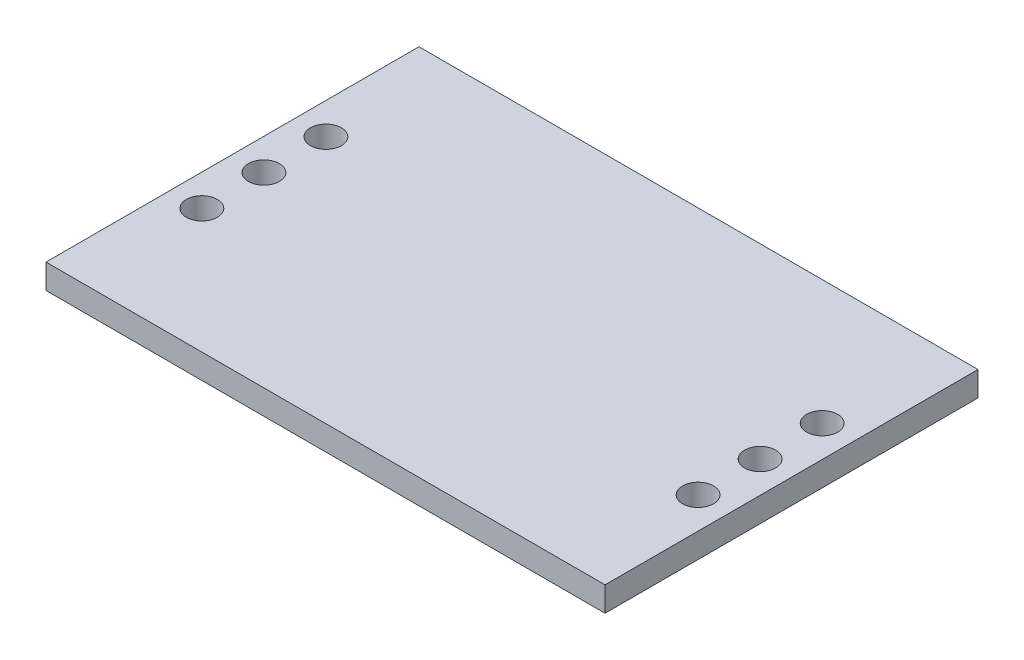
ISO-10303-21;
HEADER;
FILE_DESCRIPTION(('STEP AP214'),'2;1');
FILE_NAME('part.step','',(''),(''),'','','');
FILE_SCHEMA(('AUTOMOTIVE_DESIGN { 1 0 10303 214 1 1 1 1 }'));
ENDSEC;
DATA;
#1=APPLICATION_CONTEXT('core data for automotive mechanical design processes');
#2=APPLICATION_PROTOCOL_DEFINITION('international standard','automotive_design',2000,#1);
#3=PRODUCT_CONTEXT('',#1,'mechanical');
#4=PRODUCT('Part','Part','',(#3));
#5=PRODUCT_RELATED_PRODUCT_CATEGORY('part','',(#4));
#6=PRODUCT_DEFINITION_FORMATION('','',#4);
#7=PRODUCT_DEFINITION_CONTEXT('part definition',#1,'design');
#8=PRODUCT_DEFINITION('design','',#6,#7);
#9=PRODUCT_DEFINITION_SHAPE('','',#8);
#10=(LENGTH_UNIT() NAMED_UNIT(*) SI_UNIT(.MILLI.,.METRE.));
#11=(NAMED_UNIT(*) PLANE_ANGLE_UNIT() SI_UNIT($,.RADIAN.));
#12=(NAMED_UNIT(*) SI_UNIT($,.STERADIAN.) SOLID_ANGLE_UNIT());
#13=UNCERTAINTY_MEASURE_WITH_UNIT(LENGTH_MEASURE(1.E-05),#10,'distance_accuracy_value','');
#14=(GEOMETRIC_REPRESENTATION_CONTEXT(3) GLOBAL_UNCERTAINTY_ASSIGNED_CONTEXT((#13)) GLOBAL_UNIT_ASSIGNED_CONTEXT((#10,
#11,#12)) REPRESENTATION_CONTEXT('',''));
#15=CARTESIAN_POINT('',(0.,0.,0.));
#16=DIRECTION('',(0.,0.,1.));
#17=DIRECTION('',(1.,0.,0.));
#18=AXIS2_PLACEMENT_3D('',#15,#16,#17);
#19=CARTESIAN_POINT('',(0.,3.175,0.));
#20=DIRECTION('',(0.,-1.,0.));
#21=DIRECTION('',(0.,0.,-1.));
#22=AXIS2_PLACEMENT_3D('',#19,#20,#21);
#23=PLANE('',#22);
#24=CARTESIAN_POINT('',(18.5647089224189,3.175,-3.90059165973626));
#25=DIRECTION('',(0.,1.,0.));
#26=DIRECTION('',(0.,0.,1.));
#27=AXIS2_PLACEMENT_3D('',#24,#25,#26);
#28=CIRCLE('',#27,2.);
#29=CARTESIAN_POINT('',(18.5647089224189,3.175,-1.90059165973626));
#30=VERTEX_POINT('',#29);
#31=EDGE_CURVE('E149',#30,#30,#28,.T.);
#32=ORIENTED_EDGE('',*,*,#31,.F.);
#33=EDGE_LOOP('',(#32));
#34=FACE_BOUND('',#33,.T.);
#35=DIRECTION('',(0.,0.,1.));
#36=VECTOR('',#35,1.);
#37=CARTESIAN_POINT('',(-49.4852910775811,3.175,28.1494083402637));
#38=LINE('',#37,#36);
#39=CARTESIAN_POINT('',(-49.4852910775811,3.175,-19.9505916597363));
#40=VERTEX_POINT('',#39);
#41=CARTESIAN_POINT('',(-49.4852910775811,3.175,28.1494083402637));
#42=VERTEX_POINT('',#41);
#43=EDGE_CURVE('E98',#40,#42,#38,.T.);
#44=ORIENTED_EDGE('',*,*,#43,.T.);
#45=DIRECTION('',(1.,0.,0.));
#46=VECTOR('',#45,1.);
#47=CARTESIAN_POINT('',(22.6147089224189,3.175,28.1494083402637));
#48=LINE('',#47,#46);
#49=CARTESIAN_POINT('',(22.6147089224189,3.175,28.1494083402637));
#50=VERTEX_POINT('',#49);
#51=EDGE_CURVE('E93',#42,#50,#48,.T.);
#52=ORIENTED_EDGE('',*,*,#51,.T.);
#53=DIRECTION('',(0.,0.,-1.));
#54=VECTOR('',#53,1.);
#55=CARTESIAN_POINT('',(22.6147089224189,3.175,-19.9505916597363));
#56=LINE('',#55,#54);
#57=CARTESIAN_POINT('',(22.6147089224189,3.175,-19.9505916597363));
#58=VERTEX_POINT('',#57);
#59=EDGE_CURVE('E96',#50,#58,#56,.T.);
#60=ORIENTED_EDGE('',*,*,#59,.T.);
#61=DIRECTION('',(-1.,0.,0.));
#62=VECTOR('',#61,1.);
#63=CARTESIAN_POINT('',(-49.4852910775811,3.175,-19.9505916597363));
#64=LINE('',#63,#62);
#65=EDGE_CURVE('E63',#58,#40,#64,.T.);
#66=ORIENTED_EDGE('',*,*,#65,.T.);
#67=EDGE_LOOP('',(#44,#52,#60,#66));
#68=FACE_BOUND('',#67,.T.);
#69=CARTESIAN_POINT('',(-45.4352910775811,3.175,4.09940834026373));
#70=DIRECTION('',(0.,-1.,0.));
#71=DIRECTION('',(0.,0.,-1.));
#72=AXIS2_PLACEMENT_3D('',#69,#70,#71);
#73=CIRCLE('',#72,2.);
#74=CARTESIAN_POINT('',(-45.4352910775811,3.175,2.09940834026372));
#75=VERTEX_POINT('',#74);
#76=EDGE_CURVE('E136',#75,#75,#73,.T.);
#77=ORIENTED_EDGE('',*,*,#76,.T.);
#78=EDGE_LOOP('',(#77));
#79=FACE_BOUND('',#78,.T.);
#80=CARTESIAN_POINT('',(-45.4352910775811,3.175,-3.90059165973627));
#81=DIRECTION('',(0.,-1.,0.));
#82=DIRECTION('',(0.,0.,-1.));
#83=AXIS2_PLACEMENT_3D('',#80,#81,#82);
#84=CIRCLE('',#83,2.);
#85=CARTESIAN_POINT('',(-45.4352910775811,3.175,-5.90059165973627));
#86=VERTEX_POINT('',#85);
#87=EDGE_CURVE('E165',#86,#86,#84,.T.);
#88=ORIENTED_EDGE('',*,*,#87,.T.);
#89=EDGE_LOOP('',(#88));
#90=FACE_BOUND('',#89,.T.);
#91=CARTESIAN_POINT('',(18.5647089224189,3.175,12.0994083402637));
#92=DIRECTION('',(0.,-1.,0.));
#93=DIRECTION('',(0.,0.,-1.));
#94=AXIS2_PLACEMENT_3D('',#91,#92,#93);
#95=CIRCLE('',#94,2.);
#96=CARTESIAN_POINT('',(18.5647089224189,3.175,10.0994083402637));
#97=VERTEX_POINT('',#96);
#98=EDGE_CURVE('E140',#97,#97,#95,.T.);
#99=ORIENTED_EDGE('',*,*,#98,.T.);
#100=EDGE_LOOP('',(#99));
#101=FACE_BOUND('',#100,.T.);
#102=CARTESIAN_POINT('',(18.5647089224189,3.175,4.09940834026374));
#103=DIRECTION('',(0.,1.,0.));
#104=DIRECTION('',(0.,0.,1.));
#105=AXIS2_PLACEMENT_3D('',#102,#103,#104);
#106=CIRCLE('',#105,2.);
#107=CARTESIAN_POINT('',(18.5647089224189,3.175,6.09940834026374));
#108=VERTEX_POINT('',#107);
#109=EDGE_CURVE('E148',#108,#108,#106,.T.);
#110=ORIENTED_EDGE('',*,*,#109,.F.);
#111=EDGE_LOOP('',(#110));
#112=FACE_BOUND('',#111,.T.);
#113=CARTESIAN_POINT('',(-45.4352910775811,3.175,12.0994083402637));
#114=DIRECTION('',(0.,1.,0.));
#115=DIRECTION('',(0.,0.,1.));
#116=AXIS2_PLACEMENT_3D('',#113,#114,#115);
#117=CIRCLE('',#116,2.);
#118=CARTESIAN_POINT('',(-45.4352910775811,3.175,14.0994083402637));
#119=VERTEX_POINT('',#118);
#120=EDGE_CURVE('E164',#119,#119,#117,.T.);
#121=ORIENTED_EDGE('',*,*,#120,.F.);
#122=EDGE_LOOP('',(#121));
#123=FACE_BOUND('',#122,.T.);
#124=ADVANCED_FACE('F45',(#34,#68,#79,#90,#101,#112,#123),#23,.F.);
#125=CARTESIAN_POINT('',(0.,0.,0.));
#126=DIRECTION('',(0.,-1.,0.));
#127=DIRECTION('',(0.,0.,-1.));
#128=AXIS2_PLACEMENT_3D('',#125,#126,#127);
#129=PLANE('',#128);
#130=CARTESIAN_POINT('',(18.5647089224189,0.,12.0994083402637));
#131=DIRECTION('',(0.,-1.,0.));
#132=DIRECTION('',(0.,0.,-1.));
#133=AXIS2_PLACEMENT_3D('',#130,#131,#132);
#134=CIRCLE('',#133,2.);
#135=CARTESIAN_POINT('',(18.5647089224189,0.,10.0994083402637));
#136=VERTEX_POINT('',#135);
#137=EDGE_CURVE('E153',#136,#136,#134,.T.);
#138=ORIENTED_EDGE('',*,*,#137,.F.);
#139=EDGE_LOOP('',(#138));
#140=FACE_BOUND('',#139,.T.);
#141=CARTESIAN_POINT('',(-45.4352910775811,0.,-3.90059165973627));
#142=DIRECTION('',(0.,-1.,0.));
#143=DIRECTION('',(0.,0.,-1.));
#144=AXIS2_PLACEMENT_3D('',#141,#142,#143);
#145=CIRCLE('',#144,2.);
#146=CARTESIAN_POINT('',(-45.4352910775811,0.,-5.90059165973627));
#147=VERTEX_POINT('',#146);
#148=EDGE_CURVE('E176',#147,#147,#145,.T.);
#149=ORIENTED_EDGE('',*,*,#148,.F.);
#150=EDGE_LOOP('',(#149));
#151=FACE_BOUND('',#150,.T.);
#152=CARTESIAN_POINT('',(-45.4352910775811,0.,4.09940834026373));
#153=DIRECTION('',(0.,-1.,0.));
#154=DIRECTION('',(0.,0.,-1.));
#155=AXIS2_PLACEMENT_3D('',#152,#153,#154);
#156=CIRCLE('',#155,2.);
#157=CARTESIAN_POINT('',(-45.4352910775811,0.,2.09940834026372));
#158=VERTEX_POINT('',#157);
#159=EDGE_CURVE('E118',#158,#158,#156,.T.);
#160=ORIENTED_EDGE('',*,*,#159,.F.);
#161=EDGE_LOOP('',(#160));
#162=FACE_BOUND('',#161,.T.);
#163=DIRECTION('',(0.,0.,1.));
#164=VECTOR('',#163,1.);
#165=CARTESIAN_POINT('',(-49.4852910775811,0.,28.1494083402637));
#166=LINE('',#165,#164);
#167=CARTESIAN_POINT('',(-49.4852910775811,0.,-19.9505916597363));
#168=VERTEX_POINT('',#167);
#169=CARTESIAN_POINT('',(-49.4852910775811,0.,28.1494083402637));
#170=VERTEX_POINT('',#169);
#171=EDGE_CURVE('E114',#168,#170,#166,.T.);
#172=ORIENTED_EDGE('',*,*,#171,.F.);
#173=DIRECTION('',(-1.,0.,0.));
#174=VECTOR('',#173,1.);
#175=CARTESIAN_POINT('',(-49.4852910775811,0.,-19.9505916597363));
#176=LINE('',#175,#174);
#177=CARTESIAN_POINT('',(22.6147089224189,0.,-19.9505916597363));
#178=VERTEX_POINT('',#177);
#179=EDGE_CURVE('E86',#178,#168,#176,.T.);
#180=ORIENTED_EDGE('',*,*,#179,.F.);
#181=DIRECTION('',(0.,0.,-1.));
#182=VECTOR('',#181,1.);
#183=CARTESIAN_POINT('',(22.6147089224189,0.,-19.9505916597363));
#184=LINE('',#183,#182);
#185=CARTESIAN_POINT('',(22.6147089224189,0.,28.1494083402637));
#186=VERTEX_POINT('',#185);
#187=EDGE_CURVE('E80',#186,#178,#184,.T.);
#188=ORIENTED_EDGE('',*,*,#187,.F.);
#189=DIRECTION('',(1.,0.,0.));
#190=VECTOR('',#189,1.);
#191=CARTESIAN_POINT('',(22.6147089224189,0.,28.1494083402637));
#192=LINE('',#191,#190);
#193=EDGE_CURVE('E103',#170,#186,#192,.T.);
#194=ORIENTED_EDGE('',*,*,#193,.F.);
#195=EDGE_LOOP('',(#172,#180,#188,#194));
#196=FACE_BOUND('',#195,.T.);
#197=CARTESIAN_POINT('',(18.5647089224189,0.,4.09940834026374));
#198=DIRECTION('',(0.,1.,0.));
#199=DIRECTION('',(0.,0.,1.));
#200=AXIS2_PLACEMENT_3D('',#197,#198,#199);
#201=CIRCLE('',#200,2.);
#202=CARTESIAN_POINT('',(18.5647089224189,0.,6.09940834026374));
#203=VERTEX_POINT('',#202);
#204=EDGE_CURVE('E144',#203,#203,#201,.T.);
#205=ORIENTED_EDGE('',*,*,#204,.T.);
#206=EDGE_LOOP('',(#205));
#207=FACE_BOUND('',#206,.T.);
#208=CARTESIAN_POINT('',(18.5647089224189,0.,-3.90059165973626));
#209=DIRECTION('',(0.,1.,0.));
#210=DIRECTION('',(0.,0.,1.));
#211=AXIS2_PLACEMENT_3D('',#208,#209,#210);
#212=CIRCLE('',#211,2.);
#213=CARTESIAN_POINT('',(18.5647089224189,0.,-1.90059165973626));
#214=VERTEX_POINT('',#213);
#215=EDGE_CURVE('E169',#214,#214,#212,.T.);
#216=ORIENTED_EDGE('',*,*,#215,.T.);
#217=EDGE_LOOP('',(#216));
#218=FACE_BOUND('',#217,.T.);
#219=CARTESIAN_POINT('',(-45.4352910775811,0.,12.0994083402637));
#220=DIRECTION('',(0.,1.,0.));
#221=DIRECTION('',(0.,0.,1.));
#222=AXIS2_PLACEMENT_3D('',#219,#220,#221);
#223=CIRCLE('',#222,2.);
#224=CARTESIAN_POINT('',(-45.4352910775811,0.,14.0994083402637));
#225=VERTEX_POINT('',#224);
#226=EDGE_CURVE('E160',#225,#225,#223,.T.);
#227=ORIENTED_EDGE('',*,*,#226,.T.);
#228=EDGE_LOOP('',(#227));
#229=FACE_BOUND('',#228,.T.);
#230=ADVANCED_FACE('F131',(#140,#151,#162,#196,#207,#218,#229),#129,.T.);
#231=CARTESIAN_POINT('',(-49.4852910775811,3.175,28.1494083402637));
#232=DIRECTION('',(1.,0.,0.));
#233=DIRECTION('',(0.,0.,-1.));
#234=AXIS2_PLACEMENT_3D('',#231,#232,#233);
#235=PLANE('',#234);
#236=ORIENTED_EDGE('',*,*,#171,.T.);
#237=DIRECTION('',(0.,-1.,0.));
#238=VECTOR('',#237,1.);
#239=CARTESIAN_POINT('',(-49.4852910775811,3.175,28.1494083402637));
#240=LINE('',#239,#238);
#241=EDGE_CURVE('E11',#42,#170,#240,.T.);
#242=ORIENTED_EDGE('',*,*,#241,.F.);
#243=ORIENTED_EDGE('',*,*,#43,.F.);
#244=DIRECTION('',(0.,-1.,0.));
#245=VECTOR('',#244,1.);
#246=CARTESIAN_POINT('',(-49.4852910775811,3.175,-19.9505916597363));
#247=LINE('',#246,#245);
#248=EDGE_CURVE('E110',#40,#168,#247,.T.);
#249=ORIENTED_EDGE('',*,*,#248,.T.);
#250=EDGE_LOOP('',(#236,#242,#243,#249));
#251=FACE_BOUND('',#250,.T.);
#252=ADVANCED_FACE('F47',(#251),#235,.F.);
#253=CARTESIAN_POINT('',(22.6147089224189,3.175,28.1494083402637));
#254=DIRECTION('',(0.,0.,-1.));
#255=DIRECTION('',(-1.,0.,0.));
#256=AXIS2_PLACEMENT_3D('',#253,#254,#255);
#257=PLANE('',#256);
#258=ORIENTED_EDGE('',*,*,#193,.T.);
#259=DIRECTION('',(0.,-1.,0.));
#260=VECTOR('',#259,1.);
#261=CARTESIAN_POINT('',(22.6147089224189,3.175,28.1494083402637));
#262=LINE('',#261,#260);
#263=EDGE_CURVE('E55',#50,#186,#262,.T.);
#264=ORIENTED_EDGE('',*,*,#263,.F.);
#265=ORIENTED_EDGE('',*,*,#51,.F.);
#266=ORIENTED_EDGE('',*,*,#241,.T.);
#267=EDGE_LOOP('',(#258,#264,#265,#266));
#268=FACE_BOUND('',#267,.T.);
#269=ADVANCED_FACE('F102',(#268),#257,.F.);
#270=CARTESIAN_POINT('',(22.6147089224189,3.175,-19.9505916597363));
#271=DIRECTION('',(-1.,0.,0.));
#272=DIRECTION('',(0.,0.,1.));
#273=AXIS2_PLACEMENT_3D('',#270,#271,#272);
#274=PLANE('',#273);
#275=ORIENTED_EDGE('',*,*,#187,.T.);
#276=DIRECTION('',(0.,-1.,0.));
#277=VECTOR('',#276,1.);
#278=CARTESIAN_POINT('',(22.6147089224189,3.175,-19.9505916597363));
#279=LINE('',#278,#277);
#280=EDGE_CURVE('E105',#58,#178,#279,.T.);
#281=ORIENTED_EDGE('',*,*,#280,.F.);
#282=ORIENTED_EDGE('',*,*,#59,.F.);
#283=ORIENTED_EDGE('',*,*,#263,.T.);
#284=EDGE_LOOP('',(#275,#281,#282,#283));
#285=FACE_BOUND('',#284,.T.);
#286=ADVANCED_FACE('F106',(#285),#274,.F.);
#287=CARTESIAN_POINT('',(-49.4852910775811,3.175,-19.9505916597363));
#288=DIRECTION('',(0.,0.,1.));
#289=DIRECTION('',(1.,0.,0.));
#290=AXIS2_PLACEMENT_3D('',#287,#288,#289);
#291=PLANE('',#290);
#292=ORIENTED_EDGE('',*,*,#179,.T.);
#293=ORIENTED_EDGE('',*,*,#248,.F.);
#294=ORIENTED_EDGE('',*,*,#65,.F.);
#295=ORIENTED_EDGE('',*,*,#280,.T.);
#296=EDGE_LOOP('',(#292,#293,#294,#295));
#297=FACE_BOUND('',#296,.T.);
#298=ADVANCED_FACE('F128',(#297),#291,.F.);
#299=CARTESIAN_POINT('',(-45.4352910775811,0.,4.09940834026373));
#300=DIRECTION('',(0.,1.,0.));
#301=DIRECTION('',(0.,0.,1.));
#302=AXIS2_PLACEMENT_3D('',#299,#300,#301);
#303=CYLINDRICAL_SURFACE('',#302,2.);
#304=ORIENTED_EDGE('',*,*,#159,.T.);
#305=EDGE_LOOP('',(#304));
#306=FACE_BOUND('',#305,.T.);
#307=ORIENTED_EDGE('',*,*,#76,.F.);
#308=EDGE_LOOP('',(#307));
#309=FACE_BOUND('',#308,.T.);
#310=ADVANCED_FACE('F189',(#306,#309),#303,.F.);
#311=CARTESIAN_POINT('',(-45.4352910775811,0.,-3.90059165973627));
#312=DIRECTION('',(0.,1.,0.));
#313=DIRECTION('',(0.,0.,1.));
#314=AXIS2_PLACEMENT_3D('',#311,#312,#313);
#315=CYLINDRICAL_SURFACE('',#314,2.);
#316=ORIENTED_EDGE('',*,*,#148,.T.);
#317=EDGE_LOOP('',(#316));
#318=FACE_BOUND('',#317,.T.);
#319=ORIENTED_EDGE('',*,*,#87,.F.);
#320=EDGE_LOOP('',(#319));
#321=FACE_BOUND('',#320,.T.);
#322=ADVANCED_FACE('F186',(#318,#321),#315,.F.);
#323=CARTESIAN_POINT('',(18.5647089224189,0.,12.0994083402637));
#324=DIRECTION('',(0.,1.,0.));
#325=DIRECTION('',(0.,0.,1.));
#326=AXIS2_PLACEMENT_3D('',#323,#324,#325);
#327=CYLINDRICAL_SURFACE('',#326,2.);
#328=ORIENTED_EDGE('',*,*,#137,.T.);
#329=EDGE_LOOP('',(#328));
#330=FACE_BOUND('',#329,.T.);
#331=ORIENTED_EDGE('',*,*,#98,.F.);
#332=EDGE_LOOP('',(#331));
#333=FACE_BOUND('',#332,.T.);
#334=ADVANCED_FACE('F188',(#330,#333),#327,.F.);
#335=CARTESIAN_POINT('',(18.5647089224189,0.,4.09940834026374));
#336=DIRECTION('',(0.,1.,0.));
#337=DIRECTION('',(0.,0.,1.));
#338=AXIS2_PLACEMENT_3D('',#335,#336,#337);
#339=CYLINDRICAL_SURFACE('',#338,2.);
#340=ORIENTED_EDGE('',*,*,#204,.F.);
#341=EDGE_LOOP('',(#340));
#342=FACE_BOUND('',#341,.T.);
#343=ORIENTED_EDGE('',*,*,#109,.T.);
#344=EDGE_LOOP('',(#343));
#345=FACE_BOUND('',#344,.T.);
#346=ADVANCED_FACE('F196',(#342,#345),#339,.F.);
#347=CARTESIAN_POINT('',(18.5647089224189,0.,-3.90059165973626));
#348=DIRECTION('',(0.,1.,0.));
#349=DIRECTION('',(0.,0.,1.));
#350=AXIS2_PLACEMENT_3D('',#347,#348,#349);
#351=CYLINDRICAL_SURFACE('',#350,2.);
#352=ORIENTED_EDGE('',*,*,#215,.F.);
#353=EDGE_LOOP('',(#352));
#354=FACE_BOUND('',#353,.T.);
#355=ORIENTED_EDGE('',*,*,#31,.T.);
#356=EDGE_LOOP('',(#355));
#357=FACE_BOUND('',#356,.T.);
#358=ADVANCED_FACE('F273',(#354,#357),#351,.F.);
#359=CARTESIAN_POINT('',(-45.4352910775811,0.,12.0994083402637));
#360=DIRECTION('',(0.,1.,0.));
#361=DIRECTION('',(0.,0.,1.));
#362=AXIS2_PLACEMENT_3D('',#359,#360,#361);
#363=CYLINDRICAL_SURFACE('',#362,2.);
#364=ORIENTED_EDGE('',*,*,#226,.F.);
#365=EDGE_LOOP('',(#364));
#366=FACE_BOUND('',#365,.T.);
#367=ORIENTED_EDGE('',*,*,#120,.T.);
#368=EDGE_LOOP('',(#367));
#369=FACE_BOUND('',#368,.T.);
#370=ADVANCED_FACE('F282',(#366,#369),#363,.F.);
#371=CLOSED_SHELL('',(#124,#230,#252,#269,#286,#298,#310,#322,#334,#346,#358,#370));
#372=MANIFOLD_SOLID_BREP('B2',#371);
#373=ADVANCED_BREP_SHAPE_REPRESENTATION('',(#18,#372),#14);
#374=SHAPE_DEFINITION_REPRESENTATION(#9,#373);
ENDSEC;
END-ISO-10303-21;
